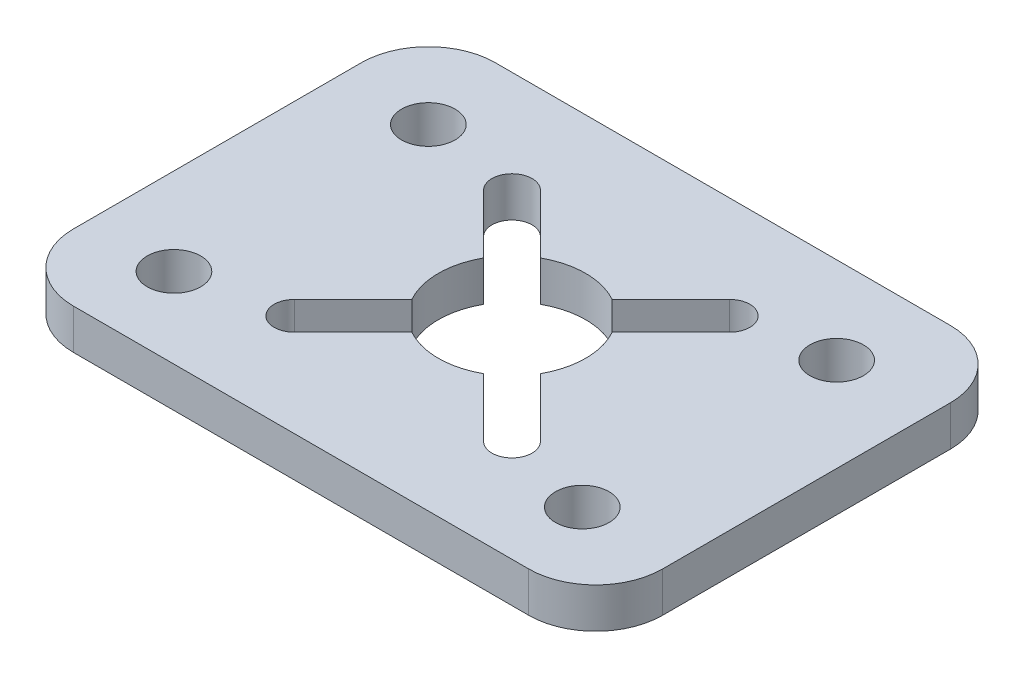
ISO-10303-21;
HEADER;
FILE_DESCRIPTION(('STEP AP214'),'2;1');
FILE_NAME('part.step','',(''),(''),'','','');
FILE_SCHEMA(('AUTOMOTIVE_DESIGN { 1 0 10303 214 1 1 1 1 }'));
ENDSEC;
DATA;
#1=APPLICATION_CONTEXT('core data for automotive mechanical design processes');
#2=APPLICATION_PROTOCOL_DEFINITION('international standard','automotive_design',2000,#1);
#3=PRODUCT_CONTEXT('',#1,'mechanical');
#4=PRODUCT('Part','Part','',(#3));
#5=PRODUCT_RELATED_PRODUCT_CATEGORY('part','',(#4));
#6=PRODUCT_DEFINITION_FORMATION('','',#4);
#7=PRODUCT_DEFINITION_CONTEXT('part definition',#1,'design');
#8=PRODUCT_DEFINITION('design','',#6,#7);
#9=PRODUCT_DEFINITION_SHAPE('','',#8);
#10=(LENGTH_UNIT() NAMED_UNIT(*) SI_UNIT(.MILLI.,.METRE.));
#11=(NAMED_UNIT(*) PLANE_ANGLE_UNIT() SI_UNIT($,.RADIAN.));
#12=(NAMED_UNIT(*) SI_UNIT($,.STERADIAN.) SOLID_ANGLE_UNIT());
#13=UNCERTAINTY_MEASURE_WITH_UNIT(LENGTH_MEASURE(1.E-05),#10,'distance_accuracy_value','');
#14=(GEOMETRIC_REPRESENTATION_CONTEXT(3) GLOBAL_UNCERTAINTY_ASSIGNED_CONTEXT((#13)) GLOBAL_UNIT_ASSIGNED_CONTEXT((#10,
#11,#12)) REPRESENTATION_CONTEXT('',''));
#15=CARTESIAN_POINT('',(0.,0.,0.));
#16=DIRECTION('',(0.,0.,1.));
#17=DIRECTION('',(1.,0.,0.));
#18=AXIS2_PLACEMENT_3D('',#15,#16,#17);
#19=CARTESIAN_POINT('',(22.,0.,-15.75));
#20=DIRECTION('',(0.,1.,0.));
#21=DIRECTION('',(0.,0.,1.));
#22=AXIS2_PLACEMENT_3D('',#19,#20,#21);
#23=CYLINDRICAL_SURFACE('',#22,5.5);
#24=CARTESIAN_POINT('',(22.,3.,-15.75));
#25=DIRECTION('',(0.,1.,0.));
#26=DIRECTION('',(0.,0.,1.));
#27=AXIS2_PLACEMENT_3D('',#24,#25,#26);
#28=CIRCLE('',#27,5.5);
#29=CARTESIAN_POINT('',(26.8023175585538,3.,-13.0690027850059));
#30=VERTEX_POINT('',#29);
#31=CARTESIAN_POINT('',(26.8023175585538,3.,-18.4309972149941));
#32=VERTEX_POINT('',#31);
#33=EDGE_CURVE('E301',#30,#32,#28,.T.);
#34=ORIENTED_EDGE('',*,*,#33,.T.);
#35=DIRECTION('',(0.,1.,0.));
#36=VECTOR('',#35,1.);
#37=CARTESIAN_POINT('',(26.8023175585538,0.,-18.4309972149941));
#38=LINE('',#37,#36);
#39=CARTESIAN_POINT('',(26.8023175585538,0.,-18.4309972149941));
#40=VERTEX_POINT('',#39);
#41=EDGE_CURVE('E251',#32,#40,#38,.F.);
#42=ORIENTED_EDGE('',*,*,#41,.T.);
#43=CARTESIAN_POINT('',(22.,0.,-15.75));
#44=DIRECTION('',(0.,1.,0.));
#45=DIRECTION('',(0.,0.,1.));
#46=AXIS2_PLACEMENT_3D('',#43,#44,#45);
#47=CIRCLE('',#46,5.5);
#48=CARTESIAN_POINT('',(26.8023175585538,0.,-13.0690027850059));
#49=VERTEX_POINT('',#48);
#50=EDGE_CURVE('E296',#49,#40,#47,.T.);
#51=ORIENTED_EDGE('',*,*,#50,.F.);
#52=DIRECTION('',(0.,1.,0.));
#53=VECTOR('',#52,1.);
#54=CARTESIAN_POINT('',(26.8023175585538,0.,-13.0690027850059));
#55=LINE('',#54,#53);
#56=EDGE_CURVE('E329',#49,#30,#55,.T.);
#57=ORIENTED_EDGE('',*,*,#56,.T.);
#58=EDGE_LOOP('',(#34,#42,#51,#57));
#59=FACE_BOUND('',#58,.T.);
#60=ADVANCED_FACE('F33',(#59),#23,.F.);
#61=CARTESIAN_POINT('',(19.3190027850058,0.,-10.9476824414463));
#62=VERTEX_POINT('',#61);
#63=CARTESIAN_POINT('',(24.6809972149941,0.,-10.9476824414462));
#64=VERTEX_POINT('',#63);
#65=EDGE_CURVE('E295',#62,#64,#47,.T.);
#66=ORIENTED_EDGE('',*,*,#65,.F.);
#67=DIRECTION('',(0.,1.,0.));
#68=VECTOR('',#67,1.);
#69=CARTESIAN_POINT('',(19.3190027850059,0.,-10.9476824414463));
#70=LINE('',#69,#68);
#71=CARTESIAN_POINT('',(19.3190027850058,3.,-10.9476824414463));
#72=VERTEX_POINT('',#71);
#73=EDGE_CURVE('E338',#62,#72,#70,.T.);
#74=ORIENTED_EDGE('',*,*,#73,.T.);
#75=CARTESIAN_POINT('',(24.6809972149941,3.,-10.9476824414462));
#76=VERTEX_POINT('',#75);
#77=EDGE_CURVE('E284',#72,#76,#28,.T.);
#78=ORIENTED_EDGE('',*,*,#77,.T.);
#79=DIRECTION('',(0.,1.,0.));
#80=VECTOR('',#79,1.);
#81=CARTESIAN_POINT('',(24.6809972149941,0.,-10.9476824414462));
#82=LINE('',#81,#80);
#83=EDGE_CURVE('E326',#76,#64,#82,.F.);
#84=ORIENTED_EDGE('',*,*,#83,.T.);
#85=EDGE_LOOP('',(#66,#74,#78,#84));
#86=FACE_BOUND('',#85,.T.);
#87=ADVANCED_FACE('F421',(#86),#23,.F.);
#88=CARTESIAN_POINT('',(24.6809972149941,0.,-20.5523175585537));
#89=VERTEX_POINT('',#88);
#90=CARTESIAN_POINT('',(19.3190027850059,0.,-20.5523175585538));
#91=VERTEX_POINT('',#90);
#92=EDGE_CURVE('E294',#89,#91,#47,.T.);
#93=ORIENTED_EDGE('',*,*,#92,.F.);
#94=DIRECTION('',(0.,1.,0.));
#95=VECTOR('',#94,1.);
#96=CARTESIAN_POINT('',(24.6809972149941,0.,-20.5523175585537));
#97=LINE('',#96,#95);
#98=CARTESIAN_POINT('',(24.6809972149941,3.,-20.5523175585537));
#99=VERTEX_POINT('',#98);
#100=EDGE_CURVE('E213',#89,#99,#97,.T.);
#101=ORIENTED_EDGE('',*,*,#100,.T.);
#102=CARTESIAN_POINT('',(19.3190027850059,3.,-20.5523175585538));
#103=VERTEX_POINT('',#102);
#104=EDGE_CURVE('E300',#99,#103,#28,.T.);
#105=ORIENTED_EDGE('',*,*,#104,.T.);
#106=DIRECTION('',(0.,1.,0.));
#107=VECTOR('',#106,1.);
#108=CARTESIAN_POINT('',(19.3190027850059,0.,-20.5523175585538));
#109=LINE('',#108,#107);
#110=EDGE_CURVE('E332',#103,#91,#109,.F.);
#111=ORIENTED_EDGE('',*,*,#110,.T.);
#112=EDGE_LOOP('',(#93,#101,#105,#111));
#113=FACE_BOUND('',#112,.T.);
#114=ADVANCED_FACE('F428',(#113),#23,.F.);
#115=CARTESIAN_POINT('',(0.,3.,0.));
#116=DIRECTION('',(1.,0.,0.));
#117=DIRECTION('',(0.,0.,-1.));
#118=AXIS2_PLACEMENT_3D('',#115,#116,#117);
#119=PLANE('',#118);
#120=DIRECTION('',(0.,0.,1.));
#121=VECTOR('',#120,1.);
#122=CARTESIAN_POINT('',(0.,0.,0.));
#123=LINE('',#122,#121);
#124=CARTESIAN_POINT('',(0.,0.,-26.5));
#125=VERTEX_POINT('',#124);
#126=CARTESIAN_POINT('',(0.,0.,-5.));
#127=VERTEX_POINT('',#126);
#128=EDGE_CURVE('E314',#125,#127,#123,.T.);
#129=ORIENTED_EDGE('',*,*,#128,.T.);
#130=DIRECTION('',(0.,-1.,0.));
#131=VECTOR('',#130,1.);
#132=CARTESIAN_POINT('',(0.,3.,-5.));
#133=LINE('',#132,#131);
#134=CARTESIAN_POINT('',(0.,3.,-5.));
#135=VERTEX_POINT('',#134);
#136=EDGE_CURVE('E11',#127,#135,#133,.F.);
#137=ORIENTED_EDGE('',*,*,#136,.T.);
#138=DIRECTION('',(0.,0.,1.));
#139=VECTOR('',#138,1.);
#140=CARTESIAN_POINT('',(0.,3.,0.));
#141=LINE('',#140,#139);
#142=CARTESIAN_POINT('',(0.,3.,-26.5));
#143=VERTEX_POINT('',#142);
#144=EDGE_CURVE('E302',#143,#135,#141,.T.);
#145=ORIENTED_EDGE('',*,*,#144,.F.);
#146=DIRECTION('',(0.,-1.,0.));
#147=VECTOR('',#146,1.);
#148=CARTESIAN_POINT('',(0.,3.,-26.5));
#149=LINE('',#148,#147);
#150=EDGE_CURVE('E41',#143,#125,#149,.T.);
#151=ORIENTED_EDGE('',*,*,#150,.T.);
#152=EDGE_LOOP('',(#129,#137,#145,#151));
#153=FACE_BOUND('',#152,.T.);
#154=ADVANCED_FACE('F386',(#153),#119,.F.);
#155=CARTESIAN_POINT('',(0.,3.,0.));
#156=DIRECTION('',(0.,0.,-1.));
#157=DIRECTION('',(-1.,0.,0.));
#158=AXIS2_PLACEMENT_3D('',#155,#156,#157);
#159=PLANE('',#158);
#160=DIRECTION('',(1.,0.,0.));
#161=VECTOR('',#160,1.);
#162=CARTESIAN_POINT('',(0.,0.,0.));
#163=LINE('',#162,#161);
#164=CARTESIAN_POINT('',(5.,0.,0.));
#165=VERTEX_POINT('',#164);
#166=CARTESIAN_POINT('',(39.,0.,0.));
#167=VERTEX_POINT('',#166);
#168=EDGE_CURVE('E317',#165,#167,#163,.T.);
#169=ORIENTED_EDGE('',*,*,#168,.T.);
#170=DIRECTION('',(0.,-1.,0.));
#171=VECTOR('',#170,1.);
#172=CARTESIAN_POINT('',(39.,3.,0.));
#173=LINE('',#172,#171);
#174=CARTESIAN_POINT('',(39.,3.,0.));
#175=VERTEX_POINT('',#174);
#176=EDGE_CURVE('E48',#167,#175,#173,.F.);
#177=ORIENTED_EDGE('',*,*,#176,.T.);
#178=DIRECTION('',(1.,0.,0.));
#179=VECTOR('',#178,1.);
#180=CARTESIAN_POINT('',(0.,3.,0.));
#181=LINE('',#180,#179);
#182=CARTESIAN_POINT('',(5.,3.,0.));
#183=VERTEX_POINT('',#182);
#184=EDGE_CURVE('E304',#183,#175,#181,.T.);
#185=ORIENTED_EDGE('',*,*,#184,.F.);
#186=DIRECTION('',(0.,-1.,0.));
#187=VECTOR('',#186,1.);
#188=CARTESIAN_POINT('',(5.,3.,0.));
#189=LINE('',#188,#187);
#190=EDGE_CURVE('E378',#183,#165,#189,.T.);
#191=ORIENTED_EDGE('',*,*,#190,.T.);
#192=EDGE_LOOP('',(#169,#177,#185,#191));
#193=FACE_BOUND('',#192,.T.);
#194=ADVANCED_FACE('F396',(#193),#159,.F.);
#195=CARTESIAN_POINT('',(44.,3.,0.));
#196=DIRECTION('',(-1.,0.,0.));
#197=DIRECTION('',(0.,0.,1.));
#198=AXIS2_PLACEMENT_3D('',#195,#196,#197);
#199=PLANE('',#198);
#200=DIRECTION('',(0.,0.,-1.));
#201=VECTOR('',#200,1.);
#202=CARTESIAN_POINT('',(44.,0.,0.));
#203=LINE('',#202,#201);
#204=CARTESIAN_POINT('',(44.,0.,-5.));
#205=VERTEX_POINT('',#204);
#206=CARTESIAN_POINT('',(44.,0.,-26.5));
#207=VERTEX_POINT('',#206);
#208=EDGE_CURVE('E319',#205,#207,#203,.T.);
#209=ORIENTED_EDGE('',*,*,#208,.T.);
#210=DIRECTION('',(0.,-1.,0.));
#211=VECTOR('',#210,1.);
#212=CARTESIAN_POINT('',(44.,3.,-26.5));
#213=LINE('',#212,#211);
#214=CARTESIAN_POINT('',(44.,3.,-26.5));
#215=VERTEX_POINT('',#214);
#216=EDGE_CURVE('E369',#207,#215,#213,.F.);
#217=ORIENTED_EDGE('',*,*,#216,.T.);
#218=DIRECTION('',(0.,0.,-1.));
#219=VECTOR('',#218,1.);
#220=CARTESIAN_POINT('',(44.,3.,0.));
#221=LINE('',#220,#219);
#222=CARTESIAN_POINT('',(44.,3.,-5.));
#223=VERTEX_POINT('',#222);
#224=EDGE_CURVE('E307',#223,#215,#221,.T.);
#225=ORIENTED_EDGE('',*,*,#224,.F.);
#226=DIRECTION('',(0.,-1.,0.));
#227=VECTOR('',#226,1.);
#228=CARTESIAN_POINT('',(44.,3.,-5.));
#229=LINE('',#228,#227);
#230=EDGE_CURVE('E366',#223,#205,#229,.T.);
#231=ORIENTED_EDGE('',*,*,#230,.T.);
#232=EDGE_LOOP('',(#209,#217,#225,#231));
#233=FACE_BOUND('',#232,.T.);
#234=ADVANCED_FACE('F406',(#233),#199,.F.);
#235=CARTESIAN_POINT('',(0.,3.,-31.5));
#236=DIRECTION('',(0.,0.,1.));
#237=DIRECTION('',(1.,0.,0.));
#238=AXIS2_PLACEMENT_3D('',#235,#236,#237);
#239=PLANE('',#238);
#240=DIRECTION('',(-1.,0.,0.));
#241=VECTOR('',#240,1.);
#242=CARTESIAN_POINT('',(0.,3.,-31.5));
#243=LINE('',#242,#241);
#244=CARTESIAN_POINT('',(39.,3.,-31.5));
#245=VERTEX_POINT('',#244);
#246=CARTESIAN_POINT('',(5.,3.,-31.5));
#247=VERTEX_POINT('',#246);
#248=EDGE_CURVE('E310',#245,#247,#243,.T.);
#249=ORIENTED_EDGE('',*,*,#248,.F.);
#250=DIRECTION('',(0.,-1.,0.));
#251=VECTOR('',#250,1.);
#252=CARTESIAN_POINT('',(39.,3.,-31.5));
#253=LINE('',#252,#251);
#254=CARTESIAN_POINT('',(39.,0.,-31.5));
#255=VERTEX_POINT('',#254);
#256=EDGE_CURVE('E355',#245,#255,#253,.T.);
#257=ORIENTED_EDGE('',*,*,#256,.T.);
#258=DIRECTION('',(-1.,0.,0.));
#259=VECTOR('',#258,1.);
#260=CARTESIAN_POINT('',(0.,0.,-31.5));
#261=LINE('',#260,#259);
#262=CARTESIAN_POINT('',(5.,0.,-31.5));
#263=VERTEX_POINT('',#262);
#264=EDGE_CURVE('E305',#255,#263,#261,.T.);
#265=ORIENTED_EDGE('',*,*,#264,.T.);
#266=DIRECTION('',(0.,-1.,0.));
#267=VECTOR('',#266,1.);
#268=CARTESIAN_POINT('',(5.,3.,-31.5));
#269=LINE('',#268,#267);
#270=EDGE_CURVE('E353',#263,#247,#269,.F.);
#271=ORIENTED_EDGE('',*,*,#270,.T.);
#272=EDGE_LOOP('',(#249,#257,#265,#271));
#273=FACE_BOUND('',#272,.T.);
#274=ADVANCED_FACE('F414',(#273),#239,.F.);
#275=CARTESIAN_POINT('',(0.,3.,0.));
#276=DIRECTION('',(0.,-1.,0.));
#277=DIRECTION('',(0.,0.,-1.));
#278=AXIS2_PLACEMENT_3D('',#275,#276,#277);
#279=PLANE('',#278);
#280=CARTESIAN_POINT('',(37.,3.,-25.));
#281=DIRECTION('',(0.,1.,0.));
#282=DIRECTION('',(0.,0.,1.));
#283=AXIS2_PLACEMENT_3D('',#280,#281,#282);
#284=CIRCLE('',#283,2.);
#285=CARTESIAN_POINT('',(37.,3.,-23.));
#286=VERTEX_POINT('',#285);
#287=EDGE_CURVE('E699',#286,#286,#284,.T.);
#288=ORIENTED_EDGE('',*,*,#287,.F.);
#289=EDGE_LOOP('',(#288));
#290=FACE_BOUND('',#289,.T.);
#291=CARTESIAN_POINT('',(6.5,3.,-25.));
#292=DIRECTION('',(0.,1.,0.));
#293=DIRECTION('',(0.,0.,1.));
#294=AXIS2_PLACEMENT_3D('',#291,#292,#293);
#295=CIRCLE('',#294,2.);
#296=CARTESIAN_POINT('',(6.5,3.,-23.));
#297=VERTEX_POINT('',#296);
#298=EDGE_CURVE('E230',#297,#297,#295,.T.);
#299=ORIENTED_EDGE('',*,*,#298,.F.);
#300=EDGE_LOOP('',(#299));
#301=FACE_BOUND('',#300,.T.);
#302=ORIENTED_EDGE('',*,*,#77,.F.);
#303=DIRECTION('',(0.707106781186551,0.,-0.707106781186544));
#304=VECTOR('',#303,1.);
#305=CARTESIAN_POINT('',(31.1923881554251,3.,-22.8210678118654));
#306=LINE('',#305,#304);
#307=CARTESIAN_POINT('',(14.9289321881345,3.,-6.55761184457492));
#308=VERTEX_POINT('',#307);
#309=EDGE_CURVE('E224',#308,#72,#306,.T.);
#310=ORIENTED_EDGE('',*,*,#309,.F.);
#311=CARTESIAN_POINT('',(13.8682720163547,3.,-7.61827201635475));
#312=DIRECTION('',(0.,1.,0.));
#313=DIRECTION('',(0.,0.,1.));
#314=AXIS2_PLACEMENT_3D('',#311,#312,#313);
#315=CIRCLE('',#314,1.5);
#316=CARTESIAN_POINT('',(12.8076118445748,3.,-8.67893218813457));
#317=VERTEX_POINT('',#316);
#318=EDGE_CURVE('E241',#317,#308,#315,.T.);
#319=ORIENTED_EDGE('',*,*,#318,.F.);
#320=DIRECTION('',(-0.707106781186551,0.,0.707106781186544));
#321=VECTOR('',#320,1.);
#322=CARTESIAN_POINT('',(29.0710678118655,3.,-24.9423881554251));
#323=LINE('',#322,#321);
#324=CARTESIAN_POINT('',(17.1976824414462,3.,-13.0690027850059));
#325=VERTEX_POINT('',#324);
#326=EDGE_CURVE('E237',#325,#317,#323,.T.);
#327=ORIENTED_EDGE('',*,*,#326,.F.);
#328=CARTESIAN_POINT('',(17.1976824414462,3.,-18.4309972149941));
#329=VERTEX_POINT('',#328);
#330=EDGE_CURVE('E297',#329,#325,#28,.T.);
#331=ORIENTED_EDGE('',*,*,#330,.F.);
#332=DIRECTION('',(0.707106781186546,0.,0.707106781186549));
#333=VECTOR('',#332,1.);
#334=CARTESIAN_POINT('',(12.8076118445749,3.,-22.8210678118655));
#335=LINE('',#334,#333);
#336=CARTESIAN_POINT('',(12.8076118445749,3.,-22.8210678118655));
#337=VERTEX_POINT('',#336);
#338=EDGE_CURVE('E274',#337,#329,#335,.T.);
#339=ORIENTED_EDGE('',*,*,#338,.F.);
#340=CARTESIAN_POINT('',(13.8682720163547,3.,-23.8817279836453));
#341=DIRECTION('',(0.,1.,0.));
#342=DIRECTION('',(0.,0.,1.));
#343=AXIS2_PLACEMENT_3D('',#340,#341,#342);
#344=CIRCLE('',#343,1.5);
#345=CARTESIAN_POINT('',(14.9289321881345,3.,-24.9423881554251));
#346=VERTEX_POINT('',#345);
#347=EDGE_CURVE('E254',#346,#337,#344,.T.);
#348=ORIENTED_EDGE('',*,*,#347,.F.);
#349=DIRECTION('',(-0.707106781186546,0.,-0.707106781186549));
#350=VECTOR('',#349,1.);
#351=CARTESIAN_POINT('',(14.9289321881345,3.,-24.9423881554251));
#352=LINE('',#351,#350);
#353=EDGE_CURVE('E279',#103,#346,#352,.T.);
#354=ORIENTED_EDGE('',*,*,#353,.F.);
#355=ORIENTED_EDGE('',*,*,#104,.F.);
#356=CARTESIAN_POINT('',(29.0710678118655,3.,-24.9423881554251));
#357=VERTEX_POINT('',#356);
#358=EDGE_CURVE('E239',#357,#99,#323,.T.);
#359=ORIENTED_EDGE('',*,*,#358,.F.);
#360=CARTESIAN_POINT('',(30.1317279836453,3.,-23.8817279836453));
#361=DIRECTION('',(0.,1.,0.));
#362=DIRECTION('',(0.,0.,1.));
#363=AXIS2_PLACEMENT_3D('',#360,#361,#362);
#364=CIRCLE('',#363,1.5);
#365=CARTESIAN_POINT('',(31.1923881554251,3.,-22.8210678118654));
#366=VERTEX_POINT('',#365);
#367=EDGE_CURVE('E203',#366,#357,#364,.T.);
#368=ORIENTED_EDGE('',*,*,#367,.F.);
#369=EDGE_CURVE('E227',#32,#366,#306,.T.);
#370=ORIENTED_EDGE('',*,*,#369,.F.);
#371=ORIENTED_EDGE('',*,*,#33,.F.);
#372=CARTESIAN_POINT('',(31.1923881554251,3.,-8.67893218813452));
#373=VERTEX_POINT('',#372);
#374=EDGE_CURVE('E259',#373,#30,#352,.T.);
#375=ORIENTED_EDGE('',*,*,#374,.F.);
#376=CARTESIAN_POINT('',(30.1317279836453,3.,-7.6182720163547));
#377=DIRECTION('',(0.,1.,0.));
#378=DIRECTION('',(0.,0.,1.));
#379=AXIS2_PLACEMENT_3D('',#376,#377,#378);
#380=CIRCLE('',#379,1.5);
#381=CARTESIAN_POINT('',(29.0710678118655,3.,-6.55761184457488));
#382=VERTEX_POINT('',#381);
#383=EDGE_CURVE('E276',#382,#373,#380,.T.);
#384=ORIENTED_EDGE('',*,*,#383,.F.);
#385=EDGE_CURVE('E273',#76,#382,#335,.T.);
#386=ORIENTED_EDGE('',*,*,#385,.F.);
#387=EDGE_LOOP('',(#302,#310,#319,#327,#331,#339,#348,#354,#355,#359,#368,#370,#371,#375,#384,#386));
#388=FACE_BOUND('',#387,.T.);
#389=ORIENTED_EDGE('',*,*,#224,.T.);
#390=CARTESIAN_POINT('',(39.,3.,-26.5));
#391=DIRECTION('',(0.,-1.,0.));
#392=DIRECTION('',(0.,0.,-1.));
#393=AXIS2_PLACEMENT_3D('',#390,#391,#392);
#394=CIRCLE('',#393,5.);
#395=EDGE_CURVE('E376',#215,#245,#394,.F.);
#396=ORIENTED_EDGE('',*,*,#395,.T.);
#397=ORIENTED_EDGE('',*,*,#248,.T.);
#398=CARTESIAN_POINT('',(5.,3.,-26.5));
#399=DIRECTION('',(0.,-1.,0.));
#400=DIRECTION('',(0.,0.,-1.));
#401=AXIS2_PLACEMENT_3D('',#398,#399,#400);
#402=CIRCLE('',#401,5.);
#403=EDGE_CURVE('E371',#247,#143,#402,.F.);
#404=ORIENTED_EDGE('',*,*,#403,.T.);
#405=ORIENTED_EDGE('',*,*,#144,.T.);
#406=CARTESIAN_POINT('',(5.,3.,-5.));
#407=DIRECTION('',(0.,-1.,0.));
#408=DIRECTION('',(0.,0.,-1.));
#409=AXIS2_PLACEMENT_3D('',#406,#407,#408);
#410=CIRCLE('',#409,5.);
#411=EDGE_CURVE('E55',#135,#183,#410,.F.);
#412=ORIENTED_EDGE('',*,*,#411,.T.);
#413=ORIENTED_EDGE('',*,*,#184,.T.);
#414=CARTESIAN_POINT('',(39.,3.,-5.));
#415=DIRECTION('',(0.,-1.,0.));
#416=DIRECTION('',(0.,0.,-1.));
#417=AXIS2_PLACEMENT_3D('',#414,#415,#416);
#418=CIRCLE('',#417,5.);
#419=EDGE_CURVE('E374',#175,#223,#418,.F.);
#420=ORIENTED_EDGE('',*,*,#419,.T.);
#421=EDGE_LOOP('',(#389,#396,#397,#404,#405,#412,#413,#420));
#422=FACE_BOUND('',#421,.T.);
#423=CARTESIAN_POINT('',(6.5,3.,-6.));
#424=DIRECTION('',(0.,1.,0.));
#425=DIRECTION('',(0.,0.,1.));
#426=AXIS2_PLACEMENT_3D('',#423,#424,#425);
#427=CIRCLE('',#426,2.);
#428=CARTESIAN_POINT('',(6.5,3.,-4.));
#429=VERTEX_POINT('',#428);
#430=EDGE_CURVE('E344',#429,#429,#427,.T.);
#431=ORIENTED_EDGE('',*,*,#430,.F.);
#432=EDGE_LOOP('',(#431));
#433=FACE_BOUND('',#432,.T.);
#434=CARTESIAN_POINT('',(37.,3.,-6.));
#435=DIRECTION('',(0.,1.,0.));
#436=DIRECTION('',(0.,0.,1.));
#437=AXIS2_PLACEMENT_3D('',#434,#435,#436);
#438=CIRCLE('',#437,2.);
#439=CARTESIAN_POINT('',(37.,3.,-4.));
#440=VERTEX_POINT('',#439);
#441=EDGE_CURVE('E350',#440,#440,#438,.T.);
#442=ORIENTED_EDGE('',*,*,#441,.F.);
#443=EDGE_LOOP('',(#442));
#444=FACE_BOUND('',#443,.T.);
#445=ADVANCED_FACE('F398',(#290,#301,#388,#422,#433,#444),#279,.F.);
#446=CARTESIAN_POINT('',(0.,0.,0.));
#447=DIRECTION('',(0.,-1.,0.));
#448=DIRECTION('',(0.,0.,-1.));
#449=AXIS2_PLACEMENT_3D('',#446,#447,#448);
#450=PLANE('',#449);
#451=CARTESIAN_POINT('',(37.,0.,-25.));
#452=DIRECTION('',(0.,1.,0.));
#453=DIRECTION('',(0.,0.,1.));
#454=AXIS2_PLACEMENT_3D('',#451,#452,#453);
#455=CIRCLE('',#454,2.);
#456=CARTESIAN_POINT('',(37.,0.,-23.));
#457=VERTEX_POINT('',#456);
#458=EDGE_CURVE('E704',#457,#457,#455,.T.);
#459=ORIENTED_EDGE('',*,*,#458,.T.);
#460=EDGE_LOOP('',(#459));
#461=FACE_BOUND('',#460,.T.);
#462=CARTESIAN_POINT('',(6.5,0.,-25.));
#463=DIRECTION('',(0.,1.,0.));
#464=DIRECTION('',(0.,0.,1.));
#465=AXIS2_PLACEMENT_3D('',#462,#463,#464);
#466=CIRCLE('',#465,2.);
#467=CARTESIAN_POINT('',(6.5,0.,-23.));
#468=VERTEX_POINT('',#467);
#469=EDGE_CURVE('E238',#468,#468,#466,.T.);
#470=ORIENTED_EDGE('',*,*,#469,.T.);
#471=EDGE_LOOP('',(#470));
#472=FACE_BOUND('',#471,.T.);
#473=DIRECTION('',(0.707106781186551,0.,-0.707106781186544));
#474=VECTOR('',#473,1.);
#475=CARTESIAN_POINT('',(31.1923881554251,0.,-22.8210678118654));
#476=LINE('',#475,#474);
#477=CARTESIAN_POINT('',(14.9289321881345,0.,-6.55761184457492));
#478=VERTEX_POINT('',#477);
#479=EDGE_CURVE('E207',#478,#62,#476,.T.);
#480=ORIENTED_EDGE('',*,*,#479,.T.);
#481=ORIENTED_EDGE('',*,*,#65,.T.);
#482=DIRECTION('',(0.707106781186546,0.,0.707106781186549));
#483=VECTOR('',#482,1.);
#484=CARTESIAN_POINT('',(12.8076118445749,0.,-22.8210678118655));
#485=LINE('',#484,#483);
#486=CARTESIAN_POINT('',(29.0710678118655,0.,-6.55761184457488));
#487=VERTEX_POINT('',#486);
#488=EDGE_CURVE('E258',#64,#487,#485,.T.);
#489=ORIENTED_EDGE('',*,*,#488,.T.);
#490=CARTESIAN_POINT('',(30.1317279836453,0.,-7.6182720163547));
#491=DIRECTION('',(0.,1.,0.));
#492=DIRECTION('',(0.,0.,1.));
#493=AXIS2_PLACEMENT_3D('',#490,#491,#492);
#494=CIRCLE('',#493,1.5);
#495=CARTESIAN_POINT('',(31.1923881554251,0.,-8.67893218813452));
#496=VERTEX_POINT('',#495);
#497=EDGE_CURVE('E263',#487,#496,#494,.T.);
#498=ORIENTED_EDGE('',*,*,#497,.T.);
#499=DIRECTION('',(-0.707106781186546,0.,-0.707106781186549));
#500=VECTOR('',#499,1.);
#501=CARTESIAN_POINT('',(14.9289321881345,0.,-24.9423881554251));
#502=LINE('',#501,#500);
#503=EDGE_CURVE('E267',#496,#49,#502,.T.);
#504=ORIENTED_EDGE('',*,*,#503,.T.);
#505=ORIENTED_EDGE('',*,*,#50,.T.);
#506=CARTESIAN_POINT('',(31.1923881554251,0.,-22.8210678118654));
#507=VERTEX_POINT('',#506);
#508=EDGE_CURVE('E223',#40,#507,#476,.T.);
#509=ORIENTED_EDGE('',*,*,#508,.T.);
#510=CARTESIAN_POINT('',(30.1317279836453,0.,-23.8817279836453));
#511=DIRECTION('',(0.,1.,0.));
#512=DIRECTION('',(0.,0.,1.));
#513=AXIS2_PLACEMENT_3D('',#510,#511,#512);
#514=CIRCLE('',#513,1.5);
#515=CARTESIAN_POINT('',(29.0710678118655,0.,-24.9423881554251));
#516=VERTEX_POINT('',#515);
#517=EDGE_CURVE('E200',#507,#516,#514,.T.);
#518=ORIENTED_EDGE('',*,*,#517,.T.);
#519=DIRECTION('',(-0.707106781186551,0.,0.707106781186544));
#520=VECTOR('',#519,1.);
#521=CARTESIAN_POINT('',(29.0710678118655,0.,-24.9423881554251));
#522=LINE('',#521,#520);
#523=EDGE_CURVE('E210',#516,#89,#522,.T.);
#524=ORIENTED_EDGE('',*,*,#523,.T.);
#525=ORIENTED_EDGE('',*,*,#92,.T.);
#526=CARTESIAN_POINT('',(14.9289321881345,0.,-24.9423881554251));
#527=VERTEX_POINT('',#526);
#528=EDGE_CURVE('E266',#91,#527,#502,.T.);
#529=ORIENTED_EDGE('',*,*,#528,.T.);
#530=CARTESIAN_POINT('',(13.8682720163547,0.,-23.8817279836453));
#531=DIRECTION('',(0.,1.,0.));
#532=DIRECTION('',(0.,0.,1.));
#533=AXIS2_PLACEMENT_3D('',#530,#531,#532);
#534=CIRCLE('',#533,1.5);
#535=CARTESIAN_POINT('',(12.8076118445749,0.,-22.8210678118655));
#536=VERTEX_POINT('',#535);
#537=EDGE_CURVE('E255',#527,#536,#534,.T.);
#538=ORIENTED_EDGE('',*,*,#537,.T.);
#539=CARTESIAN_POINT('',(17.1976824414462,0.,-18.4309972149941));
#540=VERTEX_POINT('',#539);
#541=EDGE_CURVE('E260',#536,#540,#485,.T.);
#542=ORIENTED_EDGE('',*,*,#541,.T.);
#543=CARTESIAN_POINT('',(17.1976824414462,0.,-13.0690027850059));
#544=VERTEX_POINT('',#543);
#545=EDGE_CURVE('E291',#540,#544,#47,.T.);
#546=ORIENTED_EDGE('',*,*,#545,.T.);
#547=CARTESIAN_POINT('',(12.8076118445748,0.,-8.67893218813457));
#548=VERTEX_POINT('',#547);
#549=EDGE_CURVE('E217',#544,#548,#522,.T.);
#550=ORIENTED_EDGE('',*,*,#549,.T.);
#551=CARTESIAN_POINT('',(13.8682720163547,0.,-7.61827201635475));
#552=DIRECTION('',(0.,1.,0.));
#553=DIRECTION('',(0.,0.,1.));
#554=AXIS2_PLACEMENT_3D('',#551,#552,#553);
#555=CIRCLE('',#554,1.5);
#556=EDGE_CURVE('E216',#548,#478,#555,.T.);
#557=ORIENTED_EDGE('',*,*,#556,.T.);
#558=EDGE_LOOP('',(#480,#481,#489,#498,#504,#505,#509,#518,#524,#525,#529,#538,#542,#546,#550,#557));
#559=FACE_BOUND('',#558,.T.);
#560=ORIENTED_EDGE('',*,*,#264,.F.);
#561=CARTESIAN_POINT('',(39.,0.,-26.5));
#562=DIRECTION('',(0.,-1.,0.));
#563=DIRECTION('',(0.,0.,-1.));
#564=AXIS2_PLACEMENT_3D('',#561,#562,#563);
#565=CIRCLE('',#564,5.);
#566=EDGE_CURVE('E364',#255,#207,#565,.T.);
#567=ORIENTED_EDGE('',*,*,#566,.T.);
#568=ORIENTED_EDGE('',*,*,#208,.F.);
#569=CARTESIAN_POINT('',(39.,0.,-5.));
#570=DIRECTION('',(0.,-1.,0.));
#571=DIRECTION('',(0.,0.,-1.));
#572=AXIS2_PLACEMENT_3D('',#569,#570,#571);
#573=CIRCLE('',#572,5.);
#574=EDGE_CURVE('E362',#205,#167,#573,.T.);
#575=ORIENTED_EDGE('',*,*,#574,.T.);
#576=ORIENTED_EDGE('',*,*,#168,.F.);
#577=CARTESIAN_POINT('',(5.,0.,-5.));
#578=DIRECTION('',(0.,-1.,0.));
#579=DIRECTION('',(0.,0.,-1.));
#580=AXIS2_PLACEMENT_3D('',#577,#578,#579);
#581=CIRCLE('',#580,5.);
#582=EDGE_CURVE('E360',#165,#127,#581,.T.);
#583=ORIENTED_EDGE('',*,*,#582,.T.);
#584=ORIENTED_EDGE('',*,*,#128,.F.);
#585=CARTESIAN_POINT('',(5.,0.,-26.5));
#586=DIRECTION('',(0.,-1.,0.));
#587=DIRECTION('',(0.,0.,-1.));
#588=AXIS2_PLACEMENT_3D('',#585,#586,#587);
#589=CIRCLE('',#588,5.);
#590=EDGE_CURVE('E358',#125,#263,#589,.T.);
#591=ORIENTED_EDGE('',*,*,#590,.T.);
#592=EDGE_LOOP('',(#560,#567,#568,#575,#576,#583,#584,#591));
#593=FACE_BOUND('',#592,.T.);
#594=CARTESIAN_POINT('',(6.5,0.,-6.));
#595=DIRECTION('',(0.,1.,0.));
#596=DIRECTION('',(0.,0.,1.));
#597=AXIS2_PLACEMENT_3D('',#594,#595,#596);
#598=CIRCLE('',#597,2.);
#599=CARTESIAN_POINT('',(6.5,0.,-4.));
#600=VERTEX_POINT('',#599);
#601=EDGE_CURVE('E341',#600,#600,#598,.T.);
#602=ORIENTED_EDGE('',*,*,#601,.T.);
#603=EDGE_LOOP('',(#602));
#604=FACE_BOUND('',#603,.T.);
#605=CARTESIAN_POINT('',(37.,0.,-6.));
#606=DIRECTION('',(0.,1.,0.));
#607=DIRECTION('',(0.,0.,1.));
#608=AXIS2_PLACEMENT_3D('',#605,#606,#607);
#609=CIRCLE('',#608,2.);
#610=CARTESIAN_POINT('',(37.,0.,-4.));
#611=VERTEX_POINT('',#610);
#612=EDGE_CURVE('E347',#611,#611,#609,.T.);
#613=ORIENTED_EDGE('',*,*,#612,.T.);
#614=EDGE_LOOP('',(#613));
#615=FACE_BOUND('',#614,.T.);
#616=ADVANCED_FACE('F220',(#461,#472,#559,#593,#604,#615),#450,.T.);
#617=ORIENTED_EDGE('',*,*,#330,.T.);
#618=DIRECTION('',(0.,1.,0.));
#619=VECTOR('',#618,1.);
#620=CARTESIAN_POINT('',(17.1976824414462,0.,-13.0690027850059));
#621=LINE('',#620,#619);
#622=EDGE_CURVE('E335',#325,#544,#621,.F.);
#623=ORIENTED_EDGE('',*,*,#622,.T.);
#624=ORIENTED_EDGE('',*,*,#545,.F.);
#625=DIRECTION('',(0.,1.,0.));
#626=VECTOR('',#625,1.);
#627=CARTESIAN_POINT('',(17.1976824414462,0.,-18.4309972149941));
#628=LINE('',#627,#626);
#629=EDGE_CURVE('E313',#540,#329,#628,.T.);
#630=ORIENTED_EDGE('',*,*,#629,.T.);
#631=EDGE_LOOP('',(#617,#623,#624,#630));
#632=FACE_BOUND('',#631,.T.);
#633=ADVANCED_FACE('F424',(#632),#23,.F.);
#634=CARTESIAN_POINT('',(12.8076118445749,0.,-22.8210678118655));
#635=DIRECTION('',(-0.707106781186549,0.,0.707106781186546));
#636=DIRECTION('',(0.707106781186546,0.,0.707106781186549));
#637=AXIS2_PLACEMENT_3D('',#634,#635,#636);
#638=PLANE('',#637);
#639=ORIENTED_EDGE('',*,*,#541,.F.);
#640=DIRECTION('',(0.,1.,0.));
#641=VECTOR('',#640,1.);
#642=CARTESIAN_POINT('',(12.8076118445749,0.,-22.8210678118655));
#643=LINE('',#642,#641);
#644=EDGE_CURVE('E270',#536,#337,#643,.T.);
#645=ORIENTED_EDGE('',*,*,#644,.T.);
#646=ORIENTED_EDGE('',*,*,#338,.T.);
#647=ORIENTED_EDGE('',*,*,#629,.F.);
#648=EDGE_LOOP('',(#639,#645,#646,#647));
#649=FACE_BOUND('',#648,.T.);
#650=ADVANCED_FACE('F434',(#649),#638,.F.);
#651=CARTESIAN_POINT('',(14.9289321881345,0.,-24.9423881554251));
#652=DIRECTION('',(0.707106781186548,0.,-0.707106781186546));
#653=DIRECTION('',(-0.707106781186546,0.,-0.707106781186549));
#654=AXIS2_PLACEMENT_3D('',#651,#652,#653);
#655=PLANE('',#654);
#656=ORIENTED_EDGE('',*,*,#353,.T.);
#657=DIRECTION('',(0.,1.,0.));
#658=VECTOR('',#657,1.);
#659=CARTESIAN_POINT('',(14.9289321881345,0.,-24.9423881554251));
#660=LINE('',#659,#658);
#661=EDGE_CURVE('E281',#527,#346,#660,.T.);
#662=ORIENTED_EDGE('',*,*,#661,.F.);
#663=ORIENTED_EDGE('',*,*,#528,.F.);
#664=ORIENTED_EDGE('',*,*,#110,.F.);
#665=EDGE_LOOP('',(#656,#662,#663,#664));
#666=FACE_BOUND('',#665,.T.);
#667=ADVANCED_FACE('F440',(#666),#655,.F.);
#668=CARTESIAN_POINT('',(13.8682720163547,0.,-23.8817279836453));
#669=DIRECTION('',(0.,1.,0.));
#670=DIRECTION('',(0.,0.,1.));
#671=AXIS2_PLACEMENT_3D('',#668,#669,#670);
#672=CYLINDRICAL_SURFACE('',#671,1.5);
#673=ORIENTED_EDGE('',*,*,#347,.T.);
#674=ORIENTED_EDGE('',*,*,#644,.F.);
#675=ORIENTED_EDGE('',*,*,#537,.F.);
#676=ORIENTED_EDGE('',*,*,#661,.T.);
#677=EDGE_LOOP('',(#673,#674,#675,#676));
#678=FACE_BOUND('',#677,.T.);
#679=ADVANCED_FACE('F484',(#678),#672,.F.);
#680=ORIENTED_EDGE('',*,*,#503,.F.);
#681=DIRECTION('',(0.,1.,0.));
#682=VECTOR('',#681,1.);
#683=CARTESIAN_POINT('',(31.1923881554251,0.,-8.67893218813452));
#684=LINE('',#683,#682);
#685=EDGE_CURVE('E285',#496,#373,#684,.T.);
#686=ORIENTED_EDGE('',*,*,#685,.T.);
#687=ORIENTED_EDGE('',*,*,#374,.T.);
#688=ORIENTED_EDGE('',*,*,#56,.F.);
#689=EDGE_LOOP('',(#680,#686,#687,#688));
#690=FACE_BOUND('',#689,.T.);
#691=ADVANCED_FACE('F519',(#690),#655,.F.);
#692=ORIENTED_EDGE('',*,*,#385,.T.);
#693=DIRECTION('',(0.,1.,0.));
#694=VECTOR('',#693,1.);
#695=CARTESIAN_POINT('',(29.0710678118655,0.,-6.55761184457488));
#696=LINE('',#695,#694);
#697=EDGE_CURVE('E287',#487,#382,#696,.T.);
#698=ORIENTED_EDGE('',*,*,#697,.F.);
#699=ORIENTED_EDGE('',*,*,#488,.F.);
#700=ORIENTED_EDGE('',*,*,#83,.F.);
#701=EDGE_LOOP('',(#692,#698,#699,#700));
#702=FACE_BOUND('',#701,.T.);
#703=ADVANCED_FACE('F443',(#702),#638,.F.);
#704=CARTESIAN_POINT('',(30.1317279836453,0.,-7.6182720163547));
#705=DIRECTION('',(0.,1.,0.));
#706=DIRECTION('',(0.,0.,1.));
#707=AXIS2_PLACEMENT_3D('',#704,#705,#706);
#708=CYLINDRICAL_SURFACE('',#707,1.5);
#709=ORIENTED_EDGE('',*,*,#383,.T.);
#710=ORIENTED_EDGE('',*,*,#685,.F.);
#711=ORIENTED_EDGE('',*,*,#497,.F.);
#712=ORIENTED_EDGE('',*,*,#697,.T.);
#713=EDGE_LOOP('',(#709,#710,#711,#712));
#714=FACE_BOUND('',#713,.T.);
#715=ADVANCED_FACE('F469',(#714),#708,.F.);
#716=CARTESIAN_POINT('',(31.1923881554251,0.,-22.8210678118654));
#717=DIRECTION('',(0.707106781186544,0.,0.707106781186551));
#718=DIRECTION('',(0.707106781186551,0.,-0.707106781186544));
#719=AXIS2_PLACEMENT_3D('',#716,#717,#718);
#720=PLANE('',#719);
#721=ORIENTED_EDGE('',*,*,#479,.F.);
#722=DIRECTION('',(0.,1.,0.));
#723=VECTOR('',#722,1.);
#724=CARTESIAN_POINT('',(14.9289321881345,0.,-6.55761184457492));
#725=LINE('',#724,#723);
#726=EDGE_CURVE('E246',#478,#308,#725,.T.);
#727=ORIENTED_EDGE('',*,*,#726,.T.);
#728=ORIENTED_EDGE('',*,*,#309,.T.);
#729=ORIENTED_EDGE('',*,*,#73,.F.);
#730=EDGE_LOOP('',(#721,#727,#728,#729));
#731=FACE_BOUND('',#730,.T.);
#732=ADVANCED_FACE('F496',(#731),#720,.F.);
#733=CARTESIAN_POINT('',(29.0710678118655,0.,-24.9423881554251));
#734=DIRECTION('',(-0.707106781186544,0.,-0.707106781186551));
#735=DIRECTION('',(-0.707106781186551,0.,0.707106781186544));
#736=AXIS2_PLACEMENT_3D('',#733,#734,#735);
#737=PLANE('',#736);
#738=ORIENTED_EDGE('',*,*,#326,.T.);
#739=DIRECTION('',(0.,1.,0.));
#740=VECTOR('',#739,1.);
#741=CARTESIAN_POINT('',(12.8076118445748,0.,-8.67893218813457));
#742=LINE('',#741,#740);
#743=EDGE_CURVE('E206',#548,#317,#742,.T.);
#744=ORIENTED_EDGE('',*,*,#743,.F.);
#745=ORIENTED_EDGE('',*,*,#549,.F.);
#746=ORIENTED_EDGE('',*,*,#622,.F.);
#747=EDGE_LOOP('',(#738,#744,#745,#746));
#748=FACE_BOUND('',#747,.T.);
#749=ADVANCED_FACE('F490',(#748),#737,.F.);
#750=CARTESIAN_POINT('',(13.8682720163547,0.,-7.61827201635475));
#751=DIRECTION('',(0.,1.,0.));
#752=DIRECTION('',(0.,0.,1.));
#753=AXIS2_PLACEMENT_3D('',#750,#751,#752);
#754=CYLINDRICAL_SURFACE('',#753,1.5);
#755=ORIENTED_EDGE('',*,*,#318,.T.);
#756=ORIENTED_EDGE('',*,*,#726,.F.);
#757=ORIENTED_EDGE('',*,*,#556,.F.);
#758=ORIENTED_EDGE('',*,*,#743,.T.);
#759=EDGE_LOOP('',(#755,#756,#757,#758));
#760=FACE_BOUND('',#759,.T.);
#761=ADVANCED_FACE('F493',(#760),#754,.F.);
#762=ORIENTED_EDGE('',*,*,#369,.T.);
#763=DIRECTION('',(0.,1.,0.));
#764=VECTOR('',#763,1.);
#765=CARTESIAN_POINT('',(31.1923881554251,0.,-22.8210678118654));
#766=LINE('',#765,#764);
#767=EDGE_CURVE('E244',#507,#366,#766,.T.);
#768=ORIENTED_EDGE('',*,*,#767,.F.);
#769=ORIENTED_EDGE('',*,*,#508,.F.);
#770=ORIENTED_EDGE('',*,*,#41,.F.);
#771=EDGE_LOOP('',(#762,#768,#769,#770));
#772=FACE_BOUND('',#771,.T.);
#773=ADVANCED_FACE('F476',(#772),#720,.F.);
#774=ORIENTED_EDGE('',*,*,#523,.F.);
#775=DIRECTION('',(0.,1.,0.));
#776=VECTOR('',#775,1.);
#777=CARTESIAN_POINT('',(29.0710678118655,0.,-24.9423881554251));
#778=LINE('',#777,#776);
#779=EDGE_CURVE('E195',#516,#357,#778,.T.);
#780=ORIENTED_EDGE('',*,*,#779,.T.);
#781=ORIENTED_EDGE('',*,*,#358,.T.);
#782=ORIENTED_EDGE('',*,*,#100,.F.);
#783=EDGE_LOOP('',(#774,#780,#781,#782));
#784=FACE_BOUND('',#783,.T.);
#785=ADVANCED_FACE('F211',(#784),#737,.F.);
#786=CARTESIAN_POINT('',(30.1317279836453,0.,-23.8817279836453));
#787=DIRECTION('',(0.,1.,0.));
#788=DIRECTION('',(0.,0.,1.));
#789=AXIS2_PLACEMENT_3D('',#786,#787,#788);
#790=CYLINDRICAL_SURFACE('',#789,1.5);
#791=ORIENTED_EDGE('',*,*,#367,.T.);
#792=ORIENTED_EDGE('',*,*,#779,.F.);
#793=ORIENTED_EDGE('',*,*,#517,.F.);
#794=ORIENTED_EDGE('',*,*,#767,.T.);
#795=EDGE_LOOP('',(#791,#792,#793,#794));
#796=FACE_BOUND('',#795,.T.);
#797=ADVANCED_FACE('F197',(#796),#790,.F.);
#798=CARTESIAN_POINT('',(6.5,0.,-25.));
#799=DIRECTION('',(0.,1.,0.));
#800=DIRECTION('',(0.,0.,1.));
#801=AXIS2_PLACEMENT_3D('',#798,#799,#800);
#802=CYLINDRICAL_SURFACE('',#801,2.);
#803=ORIENTED_EDGE('',*,*,#469,.F.);
#804=EDGE_LOOP('',(#803));
#805=FACE_BOUND('',#804,.T.);
#806=ORIENTED_EDGE('',*,*,#298,.T.);
#807=EDGE_LOOP('',(#806));
#808=FACE_BOUND('',#807,.T.);
#809=ADVANCED_FACE('F517',(#805,#808),#802,.F.);
#810=CARTESIAN_POINT('',(37.,0.,-25.));
#811=DIRECTION('',(0.,1.,0.));
#812=DIRECTION('',(0.,0.,1.));
#813=AXIS2_PLACEMENT_3D('',#810,#811,#812);
#814=CYLINDRICAL_SURFACE('',#813,2.);
#815=ORIENTED_EDGE('',*,*,#458,.F.);
#816=EDGE_LOOP('',(#815));
#817=FACE_BOUND('',#816,.T.);
#818=ORIENTED_EDGE('',*,*,#287,.T.);
#819=EDGE_LOOP('',(#818));
#820=FACE_BOUND('',#819,.T.);
#821=ADVANCED_FACE('F594',(#817,#820),#814,.F.);
#822=CARTESIAN_POINT('',(6.5,0.,-6.));
#823=DIRECTION('',(0.,1.,0.));
#824=DIRECTION('',(0.,0.,1.));
#825=AXIS2_PLACEMENT_3D('',#822,#823,#824);
#826=CYLINDRICAL_SURFACE('',#825,2.);
#827=ORIENTED_EDGE('',*,*,#601,.F.);
#828=EDGE_LOOP('',(#827));
#829=FACE_BOUND('',#828,.T.);
#830=ORIENTED_EDGE('',*,*,#430,.T.);
#831=EDGE_LOOP('',(#830));
#832=FACE_BOUND('',#831,.T.);
#833=ADVANCED_FACE('F603',(#829,#832),#826,.F.);
#834=CARTESIAN_POINT('',(37.,0.,-6.));
#835=DIRECTION('',(0.,1.,0.));
#836=DIRECTION('',(0.,0.,1.));
#837=AXIS2_PLACEMENT_3D('',#834,#835,#836);
#838=CYLINDRICAL_SURFACE('',#837,2.);
#839=ORIENTED_EDGE('',*,*,#612,.F.);
#840=EDGE_LOOP('',(#839));
#841=FACE_BOUND('',#840,.T.);
#842=ORIENTED_EDGE('',*,*,#441,.T.);
#843=EDGE_LOOP('',(#842));
#844=FACE_BOUND('',#843,.T.);
#845=ADVANCED_FACE('F613',(#841,#844),#838,.F.);
#846=CARTESIAN_POINT('',(39.,3.,-26.5));
#847=DIRECTION('',(0.,-1.,0.));
#848=DIRECTION('',(0.,0.,-1.));
#849=AXIS2_PLACEMENT_3D('',#846,#847,#848);
#850=CYLINDRICAL_SURFACE('',#849,5.);
#851=ORIENTED_EDGE('',*,*,#395,.F.);
#852=ORIENTED_EDGE('',*,*,#216,.F.);
#853=ORIENTED_EDGE('',*,*,#566,.F.);
#854=ORIENTED_EDGE('',*,*,#256,.F.);
#855=EDGE_LOOP('',(#851,#852,#853,#854));
#856=FACE_BOUND('',#855,.T.);
#857=ADVANCED_FACE('F411',(#856),#850,.T.);
#858=CARTESIAN_POINT('',(39.,3.,-5.));
#859=DIRECTION('',(0.,-1.,0.));
#860=DIRECTION('',(0.,0.,-1.));
#861=AXIS2_PLACEMENT_3D('',#858,#859,#860);
#862=CYLINDRICAL_SURFACE('',#861,5.);
#863=ORIENTED_EDGE('',*,*,#419,.F.);
#864=ORIENTED_EDGE('',*,*,#176,.F.);
#865=ORIENTED_EDGE('',*,*,#574,.F.);
#866=ORIENTED_EDGE('',*,*,#230,.F.);
#867=EDGE_LOOP('',(#863,#864,#865,#866));
#868=FACE_BOUND('',#867,.T.);
#869=ADVANCED_FACE('F403',(#868),#862,.T.);
#870=CARTESIAN_POINT('',(5.,3.,-5.));
#871=DIRECTION('',(0.,-1.,0.));
#872=DIRECTION('',(0.,0.,-1.));
#873=AXIS2_PLACEMENT_3D('',#870,#871,#872);
#874=CYLINDRICAL_SURFACE('',#873,5.);
#875=ORIENTED_EDGE('',*,*,#411,.F.);
#876=ORIENTED_EDGE('',*,*,#136,.F.);
#877=ORIENTED_EDGE('',*,*,#582,.F.);
#878=ORIENTED_EDGE('',*,*,#190,.F.);
#879=EDGE_LOOP('',(#875,#876,#877,#878));
#880=FACE_BOUND('',#879,.T.);
#881=ADVANCED_FACE('F395',(#880),#874,.T.);
#882=CARTESIAN_POINT('',(5.,3.,-26.5));
#883=DIRECTION('',(0.,-1.,0.));
#884=DIRECTION('',(0.,0.,-1.));
#885=AXIS2_PLACEMENT_3D('',#882,#883,#884);
#886=CYLINDRICAL_SURFACE('',#885,5.);
#887=ORIENTED_EDGE('',*,*,#403,.F.);
#888=ORIENTED_EDGE('',*,*,#270,.F.);
#889=ORIENTED_EDGE('',*,*,#590,.F.);
#890=ORIENTED_EDGE('',*,*,#150,.F.);
#891=EDGE_LOOP('',(#887,#888,#889,#890));
#892=FACE_BOUND('',#891,.T.);
#893=ADVANCED_FACE('F35',(#892),#886,.T.);
#894=CLOSED_SHELL('',(#60,#87,#114,#154,#194,#234,#274,#445,#616,#633,#650,#667,#679,#691,#703,
#715,#732,#749,#761,#773,#785,#797,#809,#821,#833,#845,#857,#869,#881,#893));
#895=MANIFOLD_SOLID_BREP('B2',#894);
#896=ADVANCED_BREP_SHAPE_REPRESENTATION('',(#18,#895),#14);
#897=SHAPE_DEFINITION_REPRESENTATION(#9,#896);
ENDSEC;
END-ISO-10303-21;
